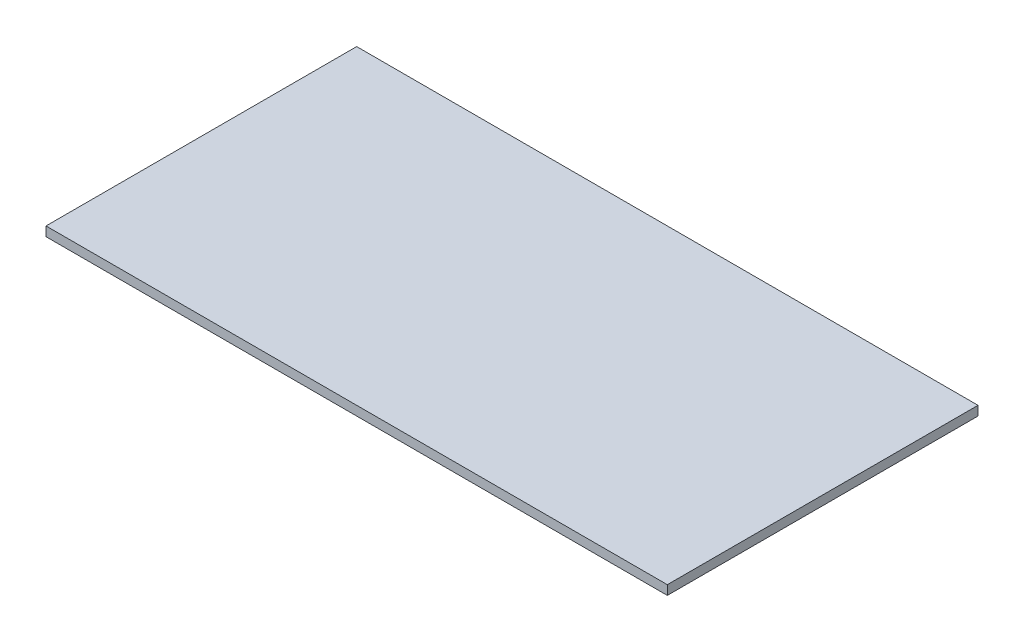
ISO-10303-21;
HEADER;
FILE_DESCRIPTION(('STEP AP214'),'2;1');
FILE_NAME('part.step','',(''),(''),'','','');
FILE_SCHEMA(('AUTOMOTIVE_DESIGN { 1 0 10303 214 1 1 1 1 }'));
ENDSEC;
DATA;
#1=APPLICATION_CONTEXT('core data for automotive mechanical design processes');
#2=APPLICATION_PROTOCOL_DEFINITION('international standard','automotive_design',2000,#1);
#3=PRODUCT_CONTEXT('',#1,'mechanical');
#4=PRODUCT('Part','Part','',(#3));
#5=PRODUCT_RELATED_PRODUCT_CATEGORY('part','',(#4));
#6=PRODUCT_DEFINITION_FORMATION('','',#4);
#7=PRODUCT_DEFINITION_CONTEXT('part definition',#1,'design');
#8=PRODUCT_DEFINITION('design','',#6,#7);
#9=PRODUCT_DEFINITION_SHAPE('','',#8);
#10=(LENGTH_UNIT() NAMED_UNIT(*) SI_UNIT(.MILLI.,.METRE.));
#11=(NAMED_UNIT(*) PLANE_ANGLE_UNIT() SI_UNIT($,.RADIAN.));
#12=(NAMED_UNIT(*) SI_UNIT($,.STERADIAN.) SOLID_ANGLE_UNIT());
#13=UNCERTAINTY_MEASURE_WITH_UNIT(LENGTH_MEASURE(1.E-05),#10,'distance_accuracy_value','');
#14=(GEOMETRIC_REPRESENTATION_CONTEXT(3) GLOBAL_UNCERTAINTY_ASSIGNED_CONTEXT((#13)) GLOBAL_UNIT_ASSIGNED_CONTEXT((#10,
#11,#12)) REPRESENTATION_CONTEXT('',''));
#15=CARTESIAN_POINT('',(0.,0.,0.));
#16=DIRECTION('',(0.,0.,1.));
#17=DIRECTION('',(1.,0.,0.));
#18=AXIS2_PLACEMENT_3D('',#15,#16,#17);
#19=CARTESIAN_POINT('',(-700.,21.,350.));
#20=DIRECTION('',(1.,0.,0.));
#21=DIRECTION('',(0.,0.,-1.));
#22=AXIS2_PLACEMENT_3D('',#19,#20,#21);
#23=PLANE('',#22);
#24=DIRECTION('',(0.,0.,1.));
#25=VECTOR('',#24,1.);
#26=CARTESIAN_POINT('',(-700.,0.,350.));
#27=LINE('',#26,#25);
#28=CARTESIAN_POINT('',(-700.,0.,-350.));
#29=VERTEX_POINT('',#28);
#30=CARTESIAN_POINT('',(-700.,0.,350.));
#31=VERTEX_POINT('',#30);
#32=EDGE_CURVE('E98',#29,#31,#27,.T.);
#33=ORIENTED_EDGE('',*,*,#32,.T.);
#34=DIRECTION('',(0.,-1.,0.));
#35=VECTOR('',#34,1.);
#36=CARTESIAN_POINT('',(-700.,21.,350.));
#37=LINE('',#36,#35);
#38=CARTESIAN_POINT('',(-700.,21.,350.));
#39=VERTEX_POINT('',#38);
#40=EDGE_CURVE('E11',#39,#31,#37,.T.);
#41=ORIENTED_EDGE('',*,*,#40,.F.);
#42=DIRECTION('',(0.,0.,1.));
#43=VECTOR('',#42,1.);
#44=CARTESIAN_POINT('',(-700.,21.,350.));
#45=LINE('',#44,#43);
#46=CARTESIAN_POINT('',(-700.,21.,-350.));
#47=VERTEX_POINT('',#46);
#48=EDGE_CURVE('E86',#47,#39,#45,.T.);
#49=ORIENTED_EDGE('',*,*,#48,.F.);
#50=DIRECTION('',(0.,-1.,0.));
#51=VECTOR('',#50,1.);
#52=CARTESIAN_POINT('',(-700.,21.,-350.));
#53=LINE('',#52,#51);
#54=EDGE_CURVE('E94',#47,#29,#53,.T.);
#55=ORIENTED_EDGE('',*,*,#54,.T.);
#56=EDGE_LOOP('',(#33,#41,#49,#55));
#57=FACE_BOUND('',#56,.T.);
#58=ADVANCED_FACE('F35',(#57),#23,.F.);
#59=CARTESIAN_POINT('',(700.,21.,350.));
#60=DIRECTION('',(0.,0.,-1.));
#61=DIRECTION('',(-1.,0.,0.));
#62=AXIS2_PLACEMENT_3D('',#59,#60,#61);
#63=PLANE('',#62);
#64=DIRECTION('',(1.,0.,0.));
#65=VECTOR('',#64,1.);
#66=CARTESIAN_POINT('',(700.,0.,350.));
#67=LINE('',#66,#65);
#68=CARTESIAN_POINT('',(700.,0.,350.));
#69=VERTEX_POINT('',#68);
#70=EDGE_CURVE('E90',#31,#69,#67,.T.);
#71=ORIENTED_EDGE('',*,*,#70,.T.);
#72=DIRECTION('',(0.,-1.,0.));
#73=VECTOR('',#72,1.);
#74=CARTESIAN_POINT('',(700.,21.,350.));
#75=LINE('',#74,#73);
#76=CARTESIAN_POINT('',(700.,21.,350.));
#77=VERTEX_POINT('',#76);
#78=EDGE_CURVE('E43',#77,#69,#75,.T.);
#79=ORIENTED_EDGE('',*,*,#78,.F.);
#80=DIRECTION('',(1.,0.,0.));
#81=VECTOR('',#80,1.);
#82=CARTESIAN_POINT('',(700.,21.,350.));
#83=LINE('',#82,#81);
#84=EDGE_CURVE('E81',#39,#77,#83,.T.);
#85=ORIENTED_EDGE('',*,*,#84,.F.);
#86=ORIENTED_EDGE('',*,*,#40,.T.);
#87=EDGE_LOOP('',(#71,#79,#85,#86));
#88=FACE_BOUND('',#87,.T.);
#89=ADVANCED_FACE('F89',(#88),#63,.F.);
#90=CARTESIAN_POINT('',(700.,21.,350.));
#91=DIRECTION('',(-1.,0.,0.));
#92=DIRECTION('',(0.,0.,1.));
#93=AXIS2_PLACEMENT_3D('',#90,#91,#92);
#94=PLANE('',#93);
#95=DIRECTION('',(0.,0.,-1.));
#96=VECTOR('',#95,1.);
#97=CARTESIAN_POINT('',(700.,0.,350.));
#98=LINE('',#97,#96);
#99=CARTESIAN_POINT('',(700.,0.,-350.));
#100=VERTEX_POINT('',#99);
#101=EDGE_CURVE('E68',#69,#100,#98,.T.);
#102=ORIENTED_EDGE('',*,*,#101,.T.);
#103=DIRECTION('',(0.,-1.,0.));
#104=VECTOR('',#103,1.);
#105=CARTESIAN_POINT('',(700.,21.,-350.));
#106=LINE('',#105,#104);
#107=CARTESIAN_POINT('',(700.,21.,-350.));
#108=VERTEX_POINT('',#107);
#109=EDGE_CURVE('E91',#108,#100,#106,.T.);
#110=ORIENTED_EDGE('',*,*,#109,.F.);
#111=DIRECTION('',(0.,0.,-1.));
#112=VECTOR('',#111,1.);
#113=CARTESIAN_POINT('',(700.,21.,350.));
#114=LINE('',#113,#112);
#115=EDGE_CURVE('E84',#77,#108,#114,.T.);
#116=ORIENTED_EDGE('',*,*,#115,.F.);
#117=ORIENTED_EDGE('',*,*,#78,.T.);
#118=EDGE_LOOP('',(#102,#110,#116,#117));
#119=FACE_BOUND('',#118,.T.);
#120=ADVANCED_FACE('F92',(#119),#94,.F.);
#121=CARTESIAN_POINT('',(700.,21.,-350.));
#122=DIRECTION('',(0.,0.,1.));
#123=DIRECTION('',(1.,0.,0.));
#124=AXIS2_PLACEMENT_3D('',#121,#122,#123);
#125=PLANE('',#124);
#126=DIRECTION('',(-1.,0.,0.));
#127=VECTOR('',#126,1.);
#128=CARTESIAN_POINT('',(700.,0.,-350.));
#129=LINE('',#128,#127);
#130=EDGE_CURVE('E74',#100,#29,#129,.T.);
#131=ORIENTED_EDGE('',*,*,#130,.T.);
#132=ORIENTED_EDGE('',*,*,#54,.F.);
#133=DIRECTION('',(-1.,0.,0.));
#134=VECTOR('',#133,1.);
#135=CARTESIAN_POINT('',(700.,21.,-350.));
#136=LINE('',#135,#134);
#137=EDGE_CURVE('E51',#108,#47,#136,.T.);
#138=ORIENTED_EDGE('',*,*,#137,.F.);
#139=ORIENTED_EDGE('',*,*,#109,.T.);
#140=EDGE_LOOP('',(#131,#132,#138,#139));
#141=FACE_BOUND('',#140,.T.);
#142=ADVANCED_FACE('F105',(#141),#125,.F.);
#143=CARTESIAN_POINT('',(0.,21.,0.));
#144=DIRECTION('',(0.,1.,0.));
#145=DIRECTION('',(0.,0.,1.));
#146=AXIS2_PLACEMENT_3D('',#143,#144,#145);
#147=PLANE('',#146);
#148=ORIENTED_EDGE('',*,*,#48,.T.);
#149=ORIENTED_EDGE('',*,*,#84,.T.);
#150=ORIENTED_EDGE('',*,*,#115,.T.);
#151=ORIENTED_EDGE('',*,*,#137,.T.);
#152=EDGE_LOOP('',(#148,#149,#150,#151));
#153=FACE_BOUND('',#152,.T.);
#154=ADVANCED_FACE('F82',(#153),#147,.T.);
#155=CARTESIAN_POINT('',(0.,0.,0.));
#156=DIRECTION('',(0.,1.,0.));
#157=DIRECTION('',(0.,0.,1.));
#158=AXIS2_PLACEMENT_3D('',#155,#156,#157);
#159=PLANE('',#158);
#160=ORIENTED_EDGE('',*,*,#32,.F.);
#161=ORIENTED_EDGE('',*,*,#130,.F.);
#162=ORIENTED_EDGE('',*,*,#101,.F.);
#163=ORIENTED_EDGE('',*,*,#70,.F.);
#164=EDGE_LOOP('',(#160,#161,#162,#163));
#165=FACE_BOUND('',#164,.T.);
#166=ADVANCED_FACE('F108',(#165),#159,.F.);
#167=CLOSED_SHELL('',(#58,#89,#120,#142,#154,#166));
#168=MANIFOLD_SOLID_BREP('B2',#167);
#169=ADVANCED_BREP_SHAPE_REPRESENTATION('',(#18,#168),#14);
#170=SHAPE_DEFINITION_REPRESENTATION(#9,#169);
ENDSEC;
END-ISO-10303-21;
